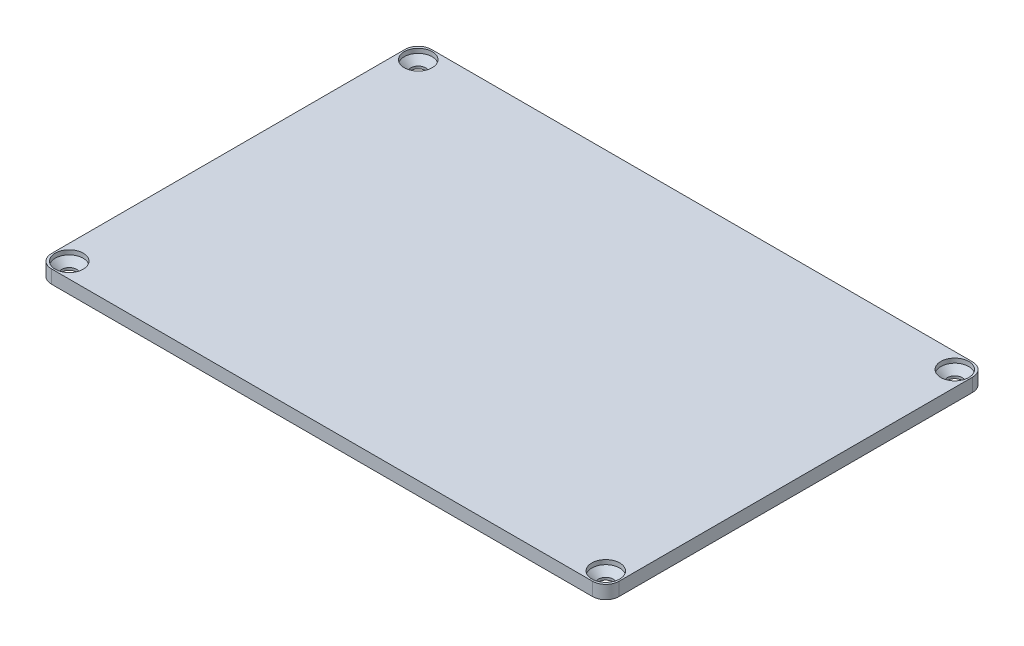
ISO-10303-21;
HEADER;
FILE_DESCRIPTION(('STEP AP214'),'2;1');
FILE_NAME('part.step','',(''),(''),'','','');
FILE_SCHEMA(('AUTOMOTIVE_DESIGN { 1 0 10303 214 1 1 1 1 }'));
ENDSEC;
DATA;
#1=APPLICATION_CONTEXT('core data for automotive mechanical design processes');
#2=APPLICATION_PROTOCOL_DEFINITION('international standard','automotive_design',2000,#1);
#3=PRODUCT_CONTEXT('',#1,'mechanical');
#4=PRODUCT('Part','Part','',(#3));
#5=PRODUCT_RELATED_PRODUCT_CATEGORY('part','',(#4));
#6=PRODUCT_DEFINITION_FORMATION('','',#4);
#7=PRODUCT_DEFINITION_CONTEXT('part definition',#1,'design');
#8=PRODUCT_DEFINITION('design','',#6,#7);
#9=PRODUCT_DEFINITION_SHAPE('','',#8);
#10=(LENGTH_UNIT() NAMED_UNIT(*) SI_UNIT(.MILLI.,.METRE.));
#11=(NAMED_UNIT(*) PLANE_ANGLE_UNIT() SI_UNIT($,.RADIAN.));
#12=(NAMED_UNIT(*) SI_UNIT($,.STERADIAN.) SOLID_ANGLE_UNIT());
#13=UNCERTAINTY_MEASURE_WITH_UNIT(LENGTH_MEASURE(1.E-05),#10,'distance_accuracy_value','');
#14=(GEOMETRIC_REPRESENTATION_CONTEXT(3) GLOBAL_UNCERTAINTY_ASSIGNED_CONTEXT((#13)) GLOBAL_UNIT_ASSIGNED_CONTEXT((#10,
#11,#12)) REPRESENTATION_CONTEXT('',''));
#15=CARTESIAN_POINT('',(0.,0.,0.));
#16=DIRECTION('',(0.,0.,1.));
#17=DIRECTION('',(1.,0.,0.));
#18=AXIS2_PLACEMENT_3D('',#15,#16,#17);
#19=CARTESIAN_POINT('',(64.,3.,42.85));
#20=DIRECTION('',(-1.,0.,0.));
#21=DIRECTION('',(0.,0.,1.));
#22=AXIS2_PLACEMENT_3D('',#19,#20,#21);
#23=PLANE('',#22);
#24=DIRECTION('',(0.,0.,-1.));
#25=VECTOR('',#24,1.);
#26=CARTESIAN_POINT('',(64.,0.,42.85));
#27=LINE('',#26,#25);
#28=CARTESIAN_POINT('',(64.,0.,39.85));
#29=VERTEX_POINT('',#28);
#30=CARTESIAN_POINT('',(64.,0.,-39.85));
#31=VERTEX_POINT('',#30);
#32=EDGE_CURVE('E131',#29,#31,#27,.T.);
#33=ORIENTED_EDGE('',*,*,#32,.T.);
#34=DIRECTION('',(0.,-1.,0.));
#35=VECTOR('',#34,1.);
#36=CARTESIAN_POINT('',(64.,3.,-39.85));
#37=LINE('',#36,#35);
#38=CARTESIAN_POINT('',(64.,3.,-39.85));
#39=VERTEX_POINT('',#38);
#40=EDGE_CURVE('E108',#31,#39,#37,.F.);
#41=ORIENTED_EDGE('',*,*,#40,.T.);
#42=DIRECTION('',(0.,0.,-1.));
#43=VECTOR('',#42,1.);
#44=CARTESIAN_POINT('',(64.,3.,42.85));
#45=LINE('',#44,#43);
#46=CARTESIAN_POINT('',(64.,3.,39.85));
#47=VERTEX_POINT('',#46);
#48=EDGE_CURVE('E141',#47,#39,#45,.T.);
#49=ORIENTED_EDGE('',*,*,#48,.F.);
#50=DIRECTION('',(0.,-1.,0.));
#51=VECTOR('',#50,1.);
#52=CARTESIAN_POINT('',(64.,3.,39.85));
#53=LINE('',#52,#51);
#54=EDGE_CURVE('E113',#47,#29,#53,.T.);
#55=ORIENTED_EDGE('',*,*,#54,.T.);
#56=EDGE_LOOP('',(#33,#41,#49,#55));
#57=FACE_BOUND('',#56,.T.);
#58=ADVANCED_FACE('F36',(#57),#23,.F.);
#59=CARTESIAN_POINT('',(-64.,3.,-42.85));
#60=DIRECTION('',(0.,0.,1.));
#61=DIRECTION('',(1.,0.,0.));
#62=AXIS2_PLACEMENT_3D('',#59,#60,#61);
#63=PLANE('',#62);
#64=DIRECTION('',(-1.,0.,0.));
#65=VECTOR('',#64,1.);
#66=CARTESIAN_POINT('',(-64.,3.,-42.85));
#67=LINE('',#66,#65);
#68=CARTESIAN_POINT('',(61.,3.,-42.85));
#69=VERTEX_POINT('',#68);
#70=CARTESIAN_POINT('',(-61.,3.,-42.85));
#71=VERTEX_POINT('',#70);
#72=EDGE_CURVE('E123',#69,#71,#67,.T.);
#73=ORIENTED_EDGE('',*,*,#72,.F.);
#74=DIRECTION('',(0.,-1.,0.));
#75=VECTOR('',#74,1.);
#76=CARTESIAN_POINT('',(61.,3.,-42.85));
#77=LINE('',#76,#75);
#78=CARTESIAN_POINT('',(61.,0.,-42.85));
#79=VERTEX_POINT('',#78);
#80=EDGE_CURVE('E107',#69,#79,#77,.T.);
#81=ORIENTED_EDGE('',*,*,#80,.T.);
#82=DIRECTION('',(-1.,0.,0.));
#83=VECTOR('',#82,1.);
#84=CARTESIAN_POINT('',(-64.,0.,-42.85));
#85=LINE('',#84,#83);
#86=CARTESIAN_POINT('',(-61.,0.,-42.85));
#87=VERTEX_POINT('',#86);
#88=EDGE_CURVE('E120',#79,#87,#85,.T.);
#89=ORIENTED_EDGE('',*,*,#88,.T.);
#90=DIRECTION('',(0.,-1.,0.));
#91=VECTOR('',#90,1.);
#92=CARTESIAN_POINT('',(-61.,3.,-42.85));
#93=LINE('',#92,#91);
#94=EDGE_CURVE('E125',#87,#71,#93,.F.);
#95=ORIENTED_EDGE('',*,*,#94,.T.);
#96=EDGE_LOOP('',(#73,#81,#89,#95));
#97=FACE_BOUND('',#96,.T.);
#98=ADVANCED_FACE('F119',(#97),#63,.F.);
#99=CARTESIAN_POINT('',(-64.,3.,42.85));
#100=DIRECTION('',(1.,0.,0.));
#101=DIRECTION('',(0.,0.,-1.));
#102=AXIS2_PLACEMENT_3D('',#99,#100,#101);
#103=PLANE('',#102);
#104=DIRECTION('',(0.,0.,1.));
#105=VECTOR('',#104,1.);
#106=CARTESIAN_POINT('',(-64.,3.,42.85));
#107=LINE('',#106,#105);
#108=CARTESIAN_POINT('',(-64.,3.,-39.85));
#109=VERTEX_POINT('',#108);
#110=CARTESIAN_POINT('',(-64.,3.,39.85));
#111=VERTEX_POINT('',#110);
#112=EDGE_CURVE('E164',#109,#111,#107,.T.);
#113=ORIENTED_EDGE('',*,*,#112,.F.);
#114=DIRECTION('',(0.,-1.,0.));
#115=VECTOR('',#114,1.);
#116=CARTESIAN_POINT('',(-64.,3.,-39.85));
#117=LINE('',#116,#115);
#118=CARTESIAN_POINT('',(-64.,0.,-39.85));
#119=VERTEX_POINT('',#118);
#120=EDGE_CURVE('E11',#109,#119,#117,.T.);
#121=ORIENTED_EDGE('',*,*,#120,.T.);
#122=DIRECTION('',(0.,0.,1.));
#123=VECTOR('',#122,1.);
#124=CARTESIAN_POINT('',(-64.,0.,42.85));
#125=LINE('',#124,#123);
#126=CARTESIAN_POINT('',(-64.,0.,39.85));
#127=VERTEX_POINT('',#126);
#128=EDGE_CURVE('E130',#119,#127,#125,.T.);
#129=ORIENTED_EDGE('',*,*,#128,.T.);
#130=DIRECTION('',(0.,-1.,0.));
#131=VECTOR('',#130,1.);
#132=CARTESIAN_POINT('',(-64.,3.,39.85));
#133=LINE('',#132,#131);
#134=EDGE_CURVE('E44',#127,#111,#133,.F.);
#135=ORIENTED_EDGE('',*,*,#134,.T.);
#136=EDGE_LOOP('',(#113,#121,#129,#135));
#137=FACE_BOUND('',#136,.T.);
#138=ADVANCED_FACE('F163',(#137),#103,.F.);
#139=CARTESIAN_POINT('',(-64.,3.,42.85));
#140=DIRECTION('',(0.,0.,-1.));
#141=DIRECTION('',(-1.,0.,0.));
#142=AXIS2_PLACEMENT_3D('',#139,#140,#141);
#143=PLANE('',#142);
#144=DIRECTION('',(1.,0.,0.));
#145=VECTOR('',#144,1.);
#146=CARTESIAN_POINT('',(-64.,0.,42.85));
#147=LINE('',#146,#145);
#148=CARTESIAN_POINT('',(-61.,0.,42.85));
#149=VERTEX_POINT('',#148);
#150=CARTESIAN_POINT('',(61.,0.,42.85));
#151=VERTEX_POINT('',#150);
#152=EDGE_CURVE('E134',#149,#151,#147,.T.);
#153=ORIENTED_EDGE('',*,*,#152,.T.);
#154=DIRECTION('',(0.,-1.,0.));
#155=VECTOR('',#154,1.);
#156=CARTESIAN_POINT('',(61.,3.,42.85));
#157=LINE('',#156,#155);
#158=CARTESIAN_POINT('',(61.,3.,42.85));
#159=VERTEX_POINT('',#158);
#160=EDGE_CURVE('E51',#151,#159,#157,.F.);
#161=ORIENTED_EDGE('',*,*,#160,.T.);
#162=DIRECTION('',(1.,0.,0.));
#163=VECTOR('',#162,1.);
#164=CARTESIAN_POINT('',(-64.,3.,42.85));
#165=LINE('',#164,#163);
#166=CARTESIAN_POINT('',(-61.,3.,42.85));
#167=VERTEX_POINT('',#166);
#168=EDGE_CURVE('E142',#167,#159,#165,.T.);
#169=ORIENTED_EDGE('',*,*,#168,.F.);
#170=DIRECTION('',(0.,-1.,0.));
#171=VECTOR('',#170,1.);
#172=CARTESIAN_POINT('',(-61.,3.,42.85));
#173=LINE('',#172,#171);
#174=EDGE_CURVE('E157',#167,#149,#173,.T.);
#175=ORIENTED_EDGE('',*,*,#174,.T.);
#176=EDGE_LOOP('',(#153,#161,#169,#175));
#177=FACE_BOUND('',#176,.T.);
#178=ADVANCED_FACE('F173',(#177),#143,.F.);
#179=CARTESIAN_POINT('',(0.,3.,0.));
#180=DIRECTION('',(0.,-1.,0.));
#181=DIRECTION('',(0.,0.,-1.));
#182=AXIS2_PLACEMENT_3D('',#179,#180,#181);
#183=PLANE('',#182);
#184=CARTESIAN_POINT('',(-60.5,3.,-39.35));
#185=DIRECTION('',(0.,1.,0.));
#186=DIRECTION('',(0.,0.,1.));
#187=AXIS2_PLACEMENT_3D('',#184,#185,#186);
#188=CIRCLE('',#187,3.15);
#189=CARTESIAN_POINT('',(-60.5,3.,-36.2));
#190=VERTEX_POINT('',#189);
#191=EDGE_CURVE('E227',#190,#190,#188,.T.);
#192=ORIENTED_EDGE('',*,*,#191,.F.);
#193=EDGE_LOOP('',(#192));
#194=FACE_BOUND('',#193,.T.);
#195=CARTESIAN_POINT('',(60.5,3.,-39.35));
#196=DIRECTION('',(0.,1.,0.));
#197=DIRECTION('',(0.,0.,1.));
#198=AXIS2_PLACEMENT_3D('',#195,#196,#197);
#199=CIRCLE('',#198,3.15);
#200=CARTESIAN_POINT('',(60.5,3.,-36.2));
#201=VERTEX_POINT('',#200);
#202=EDGE_CURVE('E215',#201,#201,#199,.T.);
#203=ORIENTED_EDGE('',*,*,#202,.F.);
#204=EDGE_LOOP('',(#203));
#205=FACE_BOUND('',#204,.T.);
#206=CARTESIAN_POINT('',(60.5,3.,39.35));
#207=DIRECTION('',(0.,1.,0.));
#208=DIRECTION('',(0.,0.,1.));
#209=AXIS2_PLACEMENT_3D('',#206,#207,#208);
#210=CIRCLE('',#209,3.15);
#211=CARTESIAN_POINT('',(60.5,3.,42.5));
#212=VERTEX_POINT('',#211);
#213=EDGE_CURVE('E203',#212,#212,#210,.T.);
#214=ORIENTED_EDGE('',*,*,#213,.F.);
#215=EDGE_LOOP('',(#214));
#216=FACE_BOUND('',#215,.T.);
#217=CARTESIAN_POINT('',(-60.5,3.,39.35));
#218=DIRECTION('',(0.,1.,0.));
#219=DIRECTION('',(0.,0.,1.));
#220=AXIS2_PLACEMENT_3D('',#217,#218,#219);
#221=CIRCLE('',#220,3.15);
#222=CARTESIAN_POINT('',(-60.5,3.,42.5));
#223=VERTEX_POINT('',#222);
#224=EDGE_CURVE('E191',#223,#223,#221,.T.);
#225=ORIENTED_EDGE('',*,*,#224,.F.);
#226=EDGE_LOOP('',(#225));
#227=FACE_BOUND('',#226,.T.);
#228=ORIENTED_EDGE('',*,*,#48,.T.);
#229=CARTESIAN_POINT('',(61.,3.,-39.85));
#230=DIRECTION('',(0.,-1.,0.));
#231=DIRECTION('',(0.,0.,-1.));
#232=AXIS2_PLACEMENT_3D('',#229,#230,#231);
#233=CIRCLE('',#232,3.);
#234=EDGE_CURVE('E155',#39,#69,#233,.F.);
#235=ORIENTED_EDGE('',*,*,#234,.T.);
#236=ORIENTED_EDGE('',*,*,#72,.T.);
#237=CARTESIAN_POINT('',(-61.,3.,-39.85));
#238=DIRECTION('',(0.,-1.,0.));
#239=DIRECTION('',(0.,0.,-1.));
#240=AXIS2_PLACEMENT_3D('',#237,#238,#239);
#241=CIRCLE('',#240,3.);
#242=EDGE_CURVE('E151',#71,#109,#241,.F.);
#243=ORIENTED_EDGE('',*,*,#242,.T.);
#244=ORIENTED_EDGE('',*,*,#112,.T.);
#245=CARTESIAN_POINT('',(-61.,3.,39.85));
#246=DIRECTION('',(0.,-1.,0.));
#247=DIRECTION('',(0.,0.,-1.));
#248=AXIS2_PLACEMENT_3D('',#245,#246,#247);
#249=CIRCLE('',#248,3.);
#250=EDGE_CURVE('E58',#111,#167,#249,.F.);
#251=ORIENTED_EDGE('',*,*,#250,.T.);
#252=ORIENTED_EDGE('',*,*,#168,.T.);
#253=CARTESIAN_POINT('',(61.,3.,39.85));
#254=DIRECTION('',(0.,-1.,0.));
#255=DIRECTION('',(0.,0.,-1.));
#256=AXIS2_PLACEMENT_3D('',#253,#254,#255);
#257=CIRCLE('',#256,3.);
#258=EDGE_CURVE('E153',#159,#47,#257,.F.);
#259=ORIENTED_EDGE('',*,*,#258,.T.);
#260=EDGE_LOOP('',(#228,#235,#236,#243,#244,#251,#252,#259));
#261=FACE_BOUND('',#260,.T.);
#262=ADVANCED_FACE('F168',(#194,#205,#216,#227,#261),#183,.F.);
#263=CARTESIAN_POINT('',(0.,0.,0.));
#264=DIRECTION('',(0.,-1.,0.));
#265=DIRECTION('',(0.,0.,-1.));
#266=AXIS2_PLACEMENT_3D('',#263,#264,#265);
#267=PLANE('',#266);
#268=CARTESIAN_POINT('',(-60.5,0.,-39.35));
#269=DIRECTION('',(0.,1.,0.));
#270=DIRECTION('',(0.,0.,1.));
#271=AXIS2_PLACEMENT_3D('',#268,#269,#270);
#272=CIRCLE('',#271,1.70000000000001);
#273=CARTESIAN_POINT('',(-60.5,0.,-37.65));
#274=VERTEX_POINT('',#273);
#275=EDGE_CURVE('E218',#274,#274,#272,.T.);
#276=ORIENTED_EDGE('',*,*,#275,.T.);
#277=EDGE_LOOP('',(#276));
#278=FACE_BOUND('',#277,.T.);
#279=CARTESIAN_POINT('',(60.5,0.,-39.35));
#280=DIRECTION('',(0.,1.,0.));
#281=DIRECTION('',(0.,0.,1.));
#282=AXIS2_PLACEMENT_3D('',#279,#280,#281);
#283=CIRCLE('',#282,1.70000000000001);
#284=CARTESIAN_POINT('',(60.5,0.,-37.65));
#285=VERTEX_POINT('',#284);
#286=EDGE_CURVE('E206',#285,#285,#283,.T.);
#287=ORIENTED_EDGE('',*,*,#286,.T.);
#288=EDGE_LOOP('',(#287));
#289=FACE_BOUND('',#288,.T.);
#290=CARTESIAN_POINT('',(60.5,0.,39.35));
#291=DIRECTION('',(0.,1.,0.));
#292=DIRECTION('',(0.,0.,1.));
#293=AXIS2_PLACEMENT_3D('',#290,#291,#292);
#294=CIRCLE('',#293,1.70000000000001);
#295=CARTESIAN_POINT('',(60.5,0.,41.05));
#296=VERTEX_POINT('',#295);
#297=EDGE_CURVE('E194',#296,#296,#294,.T.);
#298=ORIENTED_EDGE('',*,*,#297,.T.);
#299=EDGE_LOOP('',(#298));
#300=FACE_BOUND('',#299,.T.);
#301=CARTESIAN_POINT('',(-60.5,0.,39.35));
#302=DIRECTION('',(0.,1.,0.));
#303=DIRECTION('',(0.,0.,1.));
#304=AXIS2_PLACEMENT_3D('',#301,#302,#303);
#305=CIRCLE('',#304,1.70000000000001);
#306=CARTESIAN_POINT('',(-60.5,0.,41.05));
#307=VERTEX_POINT('',#306);
#308=EDGE_CURVE('E136',#307,#307,#305,.T.);
#309=ORIENTED_EDGE('',*,*,#308,.T.);
#310=EDGE_LOOP('',(#309));
#311=FACE_BOUND('',#310,.T.);
#312=ORIENTED_EDGE('',*,*,#88,.F.);
#313=CARTESIAN_POINT('',(61.,0.,-39.85));
#314=DIRECTION('',(0.,-1.,0.));
#315=DIRECTION('',(0.,0.,-1.));
#316=AXIS2_PLACEMENT_3D('',#313,#314,#315);
#317=CIRCLE('',#316,3.);
#318=EDGE_CURVE('E103',#79,#31,#317,.T.);
#319=ORIENTED_EDGE('',*,*,#318,.T.);
#320=ORIENTED_EDGE('',*,*,#32,.F.);
#321=CARTESIAN_POINT('',(61.,0.,39.85));
#322=DIRECTION('',(0.,-1.,0.));
#323=DIRECTION('',(0.,0.,-1.));
#324=AXIS2_PLACEMENT_3D('',#321,#322,#323);
#325=CIRCLE('',#324,3.);
#326=EDGE_CURVE('E114',#29,#151,#325,.T.);
#327=ORIENTED_EDGE('',*,*,#326,.T.);
#328=ORIENTED_EDGE('',*,*,#152,.F.);
#329=CARTESIAN_POINT('',(-61.,0.,39.85));
#330=DIRECTION('',(0.,-1.,0.));
#331=DIRECTION('',(0.,0.,-1.));
#332=AXIS2_PLACEMENT_3D('',#329,#330,#331);
#333=CIRCLE('',#332,3.);
#334=EDGE_CURVE('E124',#149,#127,#333,.T.);
#335=ORIENTED_EDGE('',*,*,#334,.T.);
#336=ORIENTED_EDGE('',*,*,#128,.F.);
#337=CARTESIAN_POINT('',(-61.,0.,-39.85));
#338=DIRECTION('',(0.,-1.,0.));
#339=DIRECTION('',(0.,0.,-1.));
#340=AXIS2_PLACEMENT_3D('',#337,#338,#339);
#341=CIRCLE('',#340,3.);
#342=EDGE_CURVE('E129',#119,#87,#341,.T.);
#343=ORIENTED_EDGE('',*,*,#342,.T.);
#344=EDGE_LOOP('',(#312,#319,#320,#327,#328,#335,#336,#343));
#345=FACE_BOUND('',#344,.T.);
#346=ADVANCED_FACE('F127',(#278,#289,#300,#311,#345),#267,.T.);
#347=CARTESIAN_POINT('',(-60.5,3.,39.35));
#348=DIRECTION('',(0.,1.,0.));
#349=DIRECTION('',(0.,0.,1.));
#350=AXIS2_PLACEMENT_3D('',#347,#348,#349);
#351=CYLINDRICAL_SURFACE('',#350,1.7);
#352=ORIENTED_EDGE('',*,*,#308,.F.);
#353=EDGE_LOOP('',(#352));
#354=FACE_BOUND('',#353,.T.);
#355=CARTESIAN_POINT('',(-60.5,0.550000000000001,39.35));
#356=DIRECTION('',(0.,1.,0.));
#357=DIRECTION('',(0.,0.,1.));
#358=AXIS2_PLACEMENT_3D('',#355,#356,#357);
#359=CIRCLE('',#358,1.7);
#360=CARTESIAN_POINT('',(-60.5,0.550000000000001,41.05));
#361=VERTEX_POINT('',#360);
#362=EDGE_CURVE('E185',#361,#361,#359,.T.);
#363=ORIENTED_EDGE('',*,*,#362,.T.);
#364=EDGE_LOOP('',(#363));
#365=FACE_BOUND('',#364,.T.);
#366=ADVANCED_FACE('F255',(#354,#365),#351,.F.);
#367=CARTESIAN_POINT('',(-60.5,2.,39.35));
#368=DIRECTION('',(0.,1.,0.));
#369=DIRECTION('',(0.,0.,1.));
#370=AXIS2_PLACEMENT_3D('',#367,#368,#369);
#371=CONICAL_SURFACE('',#370,3.15,0.785398163397449);
#372=ORIENTED_EDGE('',*,*,#362,.F.);
#373=EDGE_LOOP('',(#372));
#374=FACE_BOUND('',#373,.T.);
#375=CARTESIAN_POINT('',(-60.5,2.,39.35));
#376=DIRECTION('',(0.,1.,0.));
#377=DIRECTION('',(0.,0.,1.));
#378=AXIS2_PLACEMENT_3D('',#375,#376,#377);
#379=CIRCLE('',#378,3.15);
#380=CARTESIAN_POINT('',(-60.5,2.,42.5));
#381=VERTEX_POINT('',#380);
#382=EDGE_CURVE('E188',#381,#381,#379,.T.);
#383=ORIENTED_EDGE('',*,*,#382,.T.);
#384=EDGE_LOOP('',(#383));
#385=FACE_BOUND('',#384,.T.);
#386=ADVANCED_FACE('F245',(#374,#385),#371,.F.);
#387=CARTESIAN_POINT('',(-60.5,3.,39.35));
#388=DIRECTION('',(0.,1.,0.));
#389=DIRECTION('',(0.,0.,1.));
#390=AXIS2_PLACEMENT_3D('',#387,#388,#389);
#391=CYLINDRICAL_SURFACE('',#390,3.15);
#392=ORIENTED_EDGE('',*,*,#382,.F.);
#393=EDGE_LOOP('',(#392));
#394=FACE_BOUND('',#393,.T.);
#395=ORIENTED_EDGE('',*,*,#224,.T.);
#396=EDGE_LOOP('',(#395));
#397=FACE_BOUND('',#396,.T.);
#398=ADVANCED_FACE('F242',(#394,#397),#391,.F.);
#399=CARTESIAN_POINT('',(60.5,3.,39.35));
#400=DIRECTION('',(0.,1.,0.));
#401=DIRECTION('',(0.,0.,1.));
#402=AXIS2_PLACEMENT_3D('',#399,#400,#401);
#403=CYLINDRICAL_SURFACE('',#402,1.7);
#404=ORIENTED_EDGE('',*,*,#297,.F.);
#405=EDGE_LOOP('',(#404));
#406=FACE_BOUND('',#405,.T.);
#407=CARTESIAN_POINT('',(60.5,0.550000000000001,39.35));
#408=DIRECTION('',(0.,1.,0.));
#409=DIRECTION('',(0.,0.,1.));
#410=AXIS2_PLACEMENT_3D('',#407,#408,#409);
#411=CIRCLE('',#410,1.7);
#412=CARTESIAN_POINT('',(60.5,0.550000000000001,41.05));
#413=VERTEX_POINT('',#412);
#414=EDGE_CURVE('E197',#413,#413,#411,.T.);
#415=ORIENTED_EDGE('',*,*,#414,.T.);
#416=EDGE_LOOP('',(#415));
#417=FACE_BOUND('',#416,.T.);
#418=ADVANCED_FACE('F244',(#406,#417),#403,.F.);
#419=CARTESIAN_POINT('',(60.5,2.,39.35));
#420=DIRECTION('',(0.,1.,0.));
#421=DIRECTION('',(0.,0.,1.));
#422=AXIS2_PLACEMENT_3D('',#419,#420,#421);
#423=CONICAL_SURFACE('',#422,3.15,0.785398163397449);
#424=ORIENTED_EDGE('',*,*,#414,.F.);
#425=EDGE_LOOP('',(#424));
#426=FACE_BOUND('',#425,.T.);
#427=CARTESIAN_POINT('',(60.5,2.,39.35));
#428=DIRECTION('',(0.,1.,0.));
#429=DIRECTION('',(0.,0.,1.));
#430=AXIS2_PLACEMENT_3D('',#427,#428,#429);
#431=CIRCLE('',#430,3.15);
#432=CARTESIAN_POINT('',(60.5,2.,42.5));
#433=VERTEX_POINT('',#432);
#434=EDGE_CURVE('E200',#433,#433,#431,.T.);
#435=ORIENTED_EDGE('',*,*,#434,.T.);
#436=EDGE_LOOP('',(#435));
#437=FACE_BOUND('',#436,.T.);
#438=ADVANCED_FACE('F252',(#426,#437),#423,.F.);
#439=CARTESIAN_POINT('',(60.5,3.,39.35));
#440=DIRECTION('',(0.,1.,0.));
#441=DIRECTION('',(0.,0.,1.));
#442=AXIS2_PLACEMENT_3D('',#439,#440,#441);
#443=CYLINDRICAL_SURFACE('',#442,3.15);
#444=ORIENTED_EDGE('',*,*,#434,.F.);
#445=EDGE_LOOP('',(#444));
#446=FACE_BOUND('',#445,.T.);
#447=ORIENTED_EDGE('',*,*,#213,.T.);
#448=EDGE_LOOP('',(#447));
#449=FACE_BOUND('',#448,.T.);
#450=ADVANCED_FACE('F395',(#446,#449),#443,.F.);
#451=CARTESIAN_POINT('',(60.5,3.,-39.35));
#452=DIRECTION('',(0.,1.,0.));
#453=DIRECTION('',(0.,0.,1.));
#454=AXIS2_PLACEMENT_3D('',#451,#452,#453);
#455=CYLINDRICAL_SURFACE('',#454,1.7);
#456=ORIENTED_EDGE('',*,*,#286,.F.);
#457=EDGE_LOOP('',(#456));
#458=FACE_BOUND('',#457,.T.);
#459=CARTESIAN_POINT('',(60.5,0.550000000000001,-39.35));
#460=DIRECTION('',(0.,1.,0.));
#461=DIRECTION('',(0.,0.,1.));
#462=AXIS2_PLACEMENT_3D('',#459,#460,#461);
#463=CIRCLE('',#462,1.7);
#464=CARTESIAN_POINT('',(60.5,0.550000000000001,-37.65));
#465=VERTEX_POINT('',#464);
#466=EDGE_CURVE('E209',#465,#465,#463,.T.);
#467=ORIENTED_EDGE('',*,*,#466,.T.);
#468=EDGE_LOOP('',(#467));
#469=FACE_BOUND('',#468,.T.);
#470=ADVANCED_FACE('F385',(#458,#469),#455,.F.);
#471=CARTESIAN_POINT('',(60.5,2.,-39.35));
#472=DIRECTION('',(0.,1.,0.));
#473=DIRECTION('',(0.,0.,1.));
#474=AXIS2_PLACEMENT_3D('',#471,#472,#473);
#475=CONICAL_SURFACE('',#474,3.15,0.785398163397449);
#476=ORIENTED_EDGE('',*,*,#466,.F.);
#477=EDGE_LOOP('',(#476));
#478=FACE_BOUND('',#477,.T.);
#479=CARTESIAN_POINT('',(60.5,2.,-39.35));
#480=DIRECTION('',(0.,1.,0.));
#481=DIRECTION('',(0.,0.,1.));
#482=AXIS2_PLACEMENT_3D('',#479,#480,#481);
#483=CIRCLE('',#482,3.15);
#484=CARTESIAN_POINT('',(60.5,2.,-36.2));
#485=VERTEX_POINT('',#484);
#486=EDGE_CURVE('E212',#485,#485,#483,.T.);
#487=ORIENTED_EDGE('',*,*,#486,.T.);
#488=EDGE_LOOP('',(#487));
#489=FACE_BOUND('',#488,.T.);
#490=ADVANCED_FACE('F375',(#478,#489),#475,.F.);
#491=CARTESIAN_POINT('',(60.5,3.,-39.35));
#492=DIRECTION('',(0.,1.,0.));
#493=DIRECTION('',(0.,0.,1.));
#494=AXIS2_PLACEMENT_3D('',#491,#492,#493);
#495=CYLINDRICAL_SURFACE('',#494,3.15);
#496=ORIENTED_EDGE('',*,*,#486,.F.);
#497=EDGE_LOOP('',(#496));
#498=FACE_BOUND('',#497,.T.);
#499=ORIENTED_EDGE('',*,*,#202,.T.);
#500=EDGE_LOOP('',(#499));
#501=FACE_BOUND('',#500,.T.);
#502=ADVANCED_FACE('F365',(#498,#501),#495,.F.);
#503=CARTESIAN_POINT('',(-60.5,3.,-39.35));
#504=DIRECTION('',(0.,1.,0.));
#505=DIRECTION('',(0.,0.,1.));
#506=AXIS2_PLACEMENT_3D('',#503,#504,#505);
#507=CYLINDRICAL_SURFACE('',#506,1.7);
#508=ORIENTED_EDGE('',*,*,#275,.F.);
#509=EDGE_LOOP('',(#508));
#510=FACE_BOUND('',#509,.T.);
#511=CARTESIAN_POINT('',(-60.5,0.550000000000001,-39.35));
#512=DIRECTION('',(0.,1.,0.));
#513=DIRECTION('',(0.,0.,1.));
#514=AXIS2_PLACEMENT_3D('',#511,#512,#513);
#515=CIRCLE('',#514,1.7);
#516=CARTESIAN_POINT('',(-60.5,0.550000000000001,-37.65));
#517=VERTEX_POINT('',#516);
#518=EDGE_CURVE('E221',#517,#517,#515,.T.);
#519=ORIENTED_EDGE('',*,*,#518,.T.);
#520=EDGE_LOOP('',(#519));
#521=FACE_BOUND('',#520,.T.);
#522=ADVANCED_FACE('F355',(#510,#521),#507,.F.);
#523=CARTESIAN_POINT('',(-60.5,2.,-39.35));
#524=DIRECTION('',(0.,1.,0.));
#525=DIRECTION('',(0.,0.,1.));
#526=AXIS2_PLACEMENT_3D('',#523,#524,#525);
#527=CONICAL_SURFACE('',#526,3.15,0.785398163397449);
#528=ORIENTED_EDGE('',*,*,#518,.F.);
#529=EDGE_LOOP('',(#528));
#530=FACE_BOUND('',#529,.T.);
#531=CARTESIAN_POINT('',(-60.5,2.,-39.35));
#532=DIRECTION('',(0.,1.,0.));
#533=DIRECTION('',(0.,0.,1.));
#534=AXIS2_PLACEMENT_3D('',#531,#532,#533);
#535=CIRCLE('',#534,3.15);
#536=CARTESIAN_POINT('',(-60.5,2.,-36.2));
#537=VERTEX_POINT('',#536);
#538=EDGE_CURVE('E224',#537,#537,#535,.T.);
#539=ORIENTED_EDGE('',*,*,#538,.T.);
#540=EDGE_LOOP('',(#539));
#541=FACE_BOUND('',#540,.T.);
#542=ADVANCED_FACE('F345',(#530,#541),#527,.F.);
#543=CARTESIAN_POINT('',(-60.5,3.,-39.35));
#544=DIRECTION('',(0.,1.,0.));
#545=DIRECTION('',(0.,0.,1.));
#546=AXIS2_PLACEMENT_3D('',#543,#544,#545);
#547=CYLINDRICAL_SURFACE('',#546,3.15);
#548=ORIENTED_EDGE('',*,*,#538,.F.);
#549=EDGE_LOOP('',(#548));
#550=FACE_BOUND('',#549,.T.);
#551=ORIENTED_EDGE('',*,*,#191,.T.);
#552=EDGE_LOOP('',(#551));
#553=FACE_BOUND('',#552,.T.);
#554=ADVANCED_FACE('F231',(#550,#553),#547,.F.);
#555=CARTESIAN_POINT('',(61.,3.,-39.85));
#556=DIRECTION('',(0.,-1.,0.));
#557=DIRECTION('',(0.,0.,-1.));
#558=AXIS2_PLACEMENT_3D('',#555,#556,#557);
#559=CYLINDRICAL_SURFACE('',#558,3.);
#560=ORIENTED_EDGE('',*,*,#234,.F.);
#561=ORIENTED_EDGE('',*,*,#40,.F.);
#562=ORIENTED_EDGE('',*,*,#318,.F.);
#563=ORIENTED_EDGE('',*,*,#80,.F.);
#564=EDGE_LOOP('',(#560,#561,#562,#563));
#565=FACE_BOUND('',#564,.T.);
#566=ADVANCED_FACE('F106',(#565),#559,.T.);
#567=CARTESIAN_POINT('',(61.,3.,39.85));
#568=DIRECTION('',(0.,-1.,0.));
#569=DIRECTION('',(0.,0.,-1.));
#570=AXIS2_PLACEMENT_3D('',#567,#568,#569);
#571=CYLINDRICAL_SURFACE('',#570,3.);
#572=ORIENTED_EDGE('',*,*,#258,.F.);
#573=ORIENTED_EDGE('',*,*,#160,.F.);
#574=ORIENTED_EDGE('',*,*,#326,.F.);
#575=ORIENTED_EDGE('',*,*,#54,.F.);
#576=EDGE_LOOP('',(#572,#573,#574,#575));
#577=FACE_BOUND('',#576,.T.);
#578=ADVANCED_FACE('F177',(#577),#571,.T.);
#579=CARTESIAN_POINT('',(-61.,3.,-39.85));
#580=DIRECTION('',(0.,-1.,0.));
#581=DIRECTION('',(0.,0.,-1.));
#582=AXIS2_PLACEMENT_3D('',#579,#580,#581);
#583=CYLINDRICAL_SURFACE('',#582,3.);
#584=ORIENTED_EDGE('',*,*,#242,.F.);
#585=ORIENTED_EDGE('',*,*,#94,.F.);
#586=ORIENTED_EDGE('',*,*,#342,.F.);
#587=ORIENTED_EDGE('',*,*,#120,.F.);
#588=EDGE_LOOP('',(#584,#585,#586,#587));
#589=FACE_BOUND('',#588,.T.);
#590=ADVANCED_FACE('F270',(#589),#583,.T.);
#591=CARTESIAN_POINT('',(-61.,3.,39.85));
#592=DIRECTION('',(0.,-1.,0.));
#593=DIRECTION('',(0.,0.,-1.));
#594=AXIS2_PLACEMENT_3D('',#591,#592,#593);
#595=CYLINDRICAL_SURFACE('',#594,3.);
#596=ORIENTED_EDGE('',*,*,#250,.F.);
#597=ORIENTED_EDGE('',*,*,#134,.F.);
#598=ORIENTED_EDGE('',*,*,#334,.F.);
#599=ORIENTED_EDGE('',*,*,#174,.F.);
#600=EDGE_LOOP('',(#596,#597,#598,#599));
#601=FACE_BOUND('',#600,.T.);
#602=ADVANCED_FACE('F38',(#601),#595,.T.);
#603=CLOSED_SHELL('',(#58,#98,#138,#178,#262,#346,#366,#386,#398,#418,#438,#450,#470,#490,#502,
#522,#542,#554,#566,#578,#590,#602));
#604=MANIFOLD_SOLID_BREP('B2',#603);
#605=ADVANCED_BREP_SHAPE_REPRESENTATION('',(#18,#604),#14);
#606=SHAPE_DEFINITION_REPRESENTATION(#9,#605);
ENDSEC;
END-ISO-10303-21;
